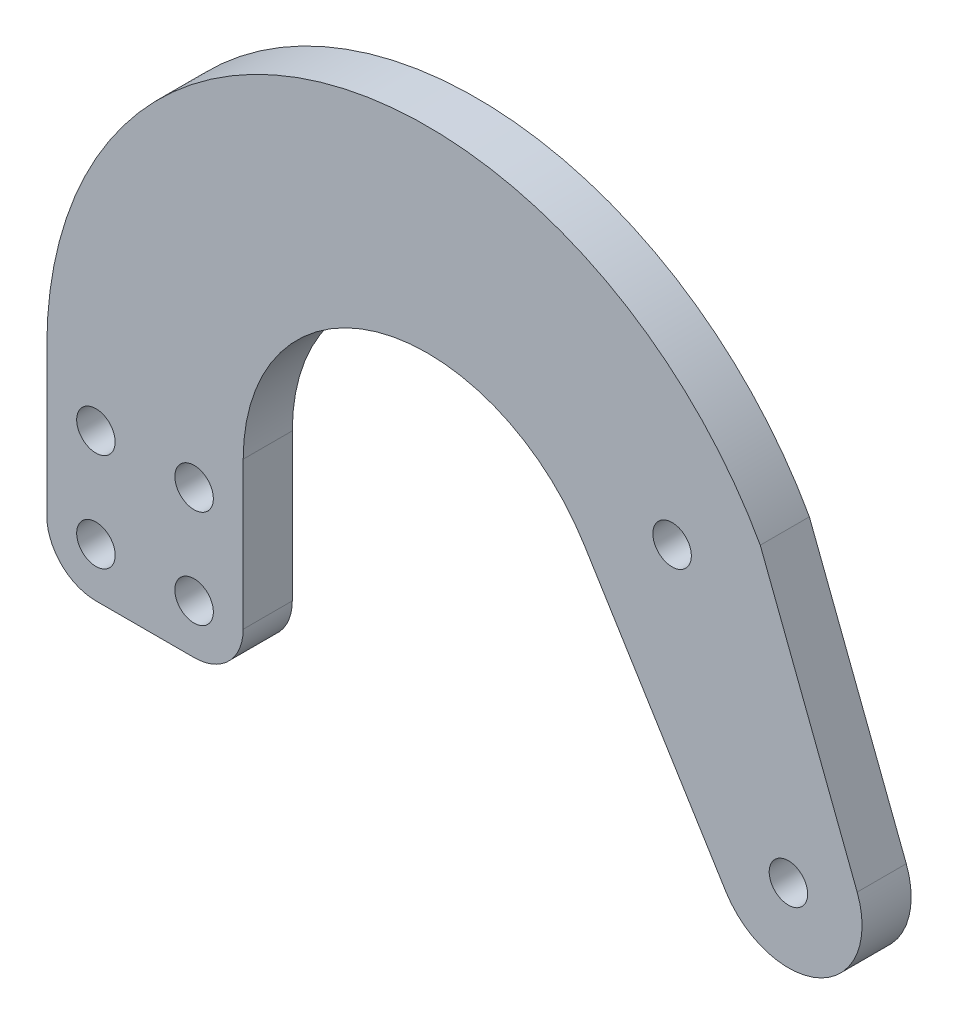
ISO-10303-21;
HEADER;
FILE_DESCRIPTION(('STEP AP214'),'2;1');
FILE_NAME('part.step','',(''),(''),'','','');
FILE_SCHEMA(('AUTOMOTIVE_DESIGN { 1 0 10303 214 1 1 1 1 }'));
ENDSEC;
DATA;
#1=APPLICATION_CONTEXT('core data for automotive mechanical design processes');
#2=APPLICATION_PROTOCOL_DEFINITION('international standard','automotive_design',2000,#1);
#3=PRODUCT_CONTEXT('',#1,'mechanical');
#4=PRODUCT('Part','Part','',(#3));
#5=PRODUCT_RELATED_PRODUCT_CATEGORY('part','',(#4));
#6=PRODUCT_DEFINITION_FORMATION('','',#4);
#7=PRODUCT_DEFINITION_CONTEXT('part definition',#1,'design');
#8=PRODUCT_DEFINITION('design','',#6,#7);
#9=PRODUCT_DEFINITION_SHAPE('','',#8);
#10=(LENGTH_UNIT() NAMED_UNIT(*) SI_UNIT(.MILLI.,.METRE.));
#11=(NAMED_UNIT(*) PLANE_ANGLE_UNIT() SI_UNIT($,.RADIAN.));
#12=(NAMED_UNIT(*) SI_UNIT($,.STERADIAN.) SOLID_ANGLE_UNIT());
#13=UNCERTAINTY_MEASURE_WITH_UNIT(LENGTH_MEASURE(1.E-05),#10,'distance_accuracy_value','');
#14=(GEOMETRIC_REPRESENTATION_CONTEXT(3) GLOBAL_UNCERTAINTY_ASSIGNED_CONTEXT((#13)) GLOBAL_UNIT_ASSIGNED_CONTEXT((#10,
#11,#12)) REPRESENTATION_CONTEXT('',''));
#15=CARTESIAN_POINT('',(0.,0.,0.));
#16=DIRECTION('',(0.,0.,1.));
#17=DIRECTION('',(1.,0.,0.));
#18=AXIS2_PLACEMENT_3D('',#15,#16,#17);
#19=CARTESIAN_POINT('',(419.576393347955,161.363289638392,6.35));
#20=DIRECTION('',(-0.933354733382761,-0.358955347741184,0.));
#21=DIRECTION('',(0.358955347741184,-0.933354733382761,0.));
#22=AXIS2_PLACEMENT_3D('',#19,#20,#21);
#23=PLANE('',#22);
#24=DIRECTION('',(0.358955347741184,-0.933354733382761,0.));
#25=VECTOR('',#24,1.);
#26=CARTESIAN_POINT('',(419.576393347955,161.363289638392,0.));
#27=LINE('',#26,#25);
#28=CARTESIAN_POINT('',(104.980295392846,979.375220587149,0.));
#29=VERTEX_POINT('',#28);
#30=CARTESIAN_POINT('',(117.516810912706,946.777806523756,0.));
#31=VERTEX_POINT('',#30);
#32=EDGE_CURVE('E140',#29,#31,#27,.T.);
#33=ORIENTED_EDGE('',*,*,#32,.F.);
#34=DIRECTION('',(0.,0.,-1.));
#35=VECTOR('',#34,1.);
#36=CARTESIAN_POINT('',(104.980295392846,979.375220587149,6.35));
#37=LINE('',#36,#35);
#38=CARTESIAN_POINT('',(104.980295392846,979.375220587149,6.35));
#39=VERTEX_POINT('',#38);
#40=EDGE_CURVE('E121',#39,#29,#37,.T.);
#41=ORIENTED_EDGE('',*,*,#40,.F.);
#42=DIRECTION('',(0.358955347741184,-0.933354733382761,0.));
#43=VECTOR('',#42,1.);
#44=CARTESIAN_POINT('',(419.576393347955,161.363289638392,6.35));
#45=LINE('',#44,#43);
#46=CARTESIAN_POINT('',(117.516810912706,946.777806523756,6.35));
#47=VERTEX_POINT('',#46);
#48=EDGE_CURVE('E128',#39,#47,#45,.T.);
#49=ORIENTED_EDGE('',*,*,#48,.T.);
#50=DIRECTION('',(0.,0.,-1.));
#51=VECTOR('',#50,1.);
#52=CARTESIAN_POINT('',(117.516810912706,946.777806523756,6.35));
#53=LINE('',#52,#51);
#54=EDGE_CURVE('E151',#47,#31,#53,.T.);
#55=ORIENTED_EDGE('',*,*,#54,.T.);
#56=EDGE_LOOP('',(#33,#41,#49,#55));
#57=FACE_BOUND('',#56,.T.);
#58=ADVANCED_FACE('F41',(#57),#23,.F.);
#59=CARTESIAN_POINT('',(108.626607077235,943.358756836521,6.35));
#60=DIRECTION('',(0.,0.,-1.));
#61=DIRECTION('',(1.,0.,0.));
#62=AXIS2_PLACEMENT_3D('',#59,#60,#61);
#63=CYLINDRICAL_SURFACE('',#62,9.52500000000029);
#64=CARTESIAN_POINT('',(108.626607077235,943.358756836521,0.));
#65=DIRECTION('',(0.,0.,1.));
#66=DIRECTION('',(1.,0.,0.));
#67=AXIS2_PLACEMENT_3D('',#64,#65,#66);
#68=CIRCLE('',#67,9.52500000000029);
#69=CARTESIAN_POINT('',(100.521849556355,938.354905267206,0.));
#70=VERTEX_POINT('',#69);
#71=EDGE_CURVE('E214',#70,#31,#68,.T.);
#72=ORIENTED_EDGE('',*,*,#71,.T.);
#73=ORIENTED_EDGE('',*,*,#54,.F.);
#74=CARTESIAN_POINT('',(108.626607077235,943.358756836521,6.35));
#75=DIRECTION('',(0.,0.,1.));
#76=DIRECTION('',(1.,0.,0.));
#77=AXIS2_PLACEMENT_3D('',#74,#75,#76);
#78=CIRCLE('',#77,9.52500000000029);
#79=CARTESIAN_POINT('',(100.521849556355,938.354905267206,6.35));
#80=VERTEX_POINT('',#79);
#81=EDGE_CURVE('E133',#80,#47,#78,.T.);
#82=ORIENTED_EDGE('',*,*,#81,.F.);
#83=DIRECTION('',(0.,0.,-1.));
#84=VECTOR('',#83,1.);
#85=CARTESIAN_POINT('',(100.521849556355,938.354905267206,6.35));
#86=LINE('',#85,#84);
#87=EDGE_CURVE('E218',#80,#70,#86,.T.);
#88=ORIENTED_EDGE('',*,*,#87,.T.);
#89=EDGE_LOOP('',(#72,#73,#82,#88));
#90=FACE_BOUND('',#89,.T.);
#91=ADVANCED_FACE('F239',(#90),#63,.T.);
#92=CARTESIAN_POINT('',(492.231106998098,303.901923144798,6.35));
#93=DIRECTION('',(-0.850893178045195,-0.525338747434593,0.));
#94=DIRECTION('',(0.525338747434593,-0.850893178045196,0.));
#95=AXIS2_PLACEMENT_3D('',#92,#93,#94);
#96=PLANE('',#95);
#97=DIRECTION('',(0.525338747434593,-0.850893178045196,0.));
#98=VECTOR('',#97,1.);
#99=CARTESIAN_POINT('',(492.231106998098,303.901923144798,0.));
#100=LINE('',#99,#98);
#101=CARTESIAN_POINT('',(82.1743938022014,968.072349510435,0.));
#102=VERTEX_POINT('',#101);
#103=EDGE_CURVE('E212',#102,#70,#100,.T.);
#104=ORIENTED_EDGE('',*,*,#103,.T.);
#105=ORIENTED_EDGE('',*,*,#87,.F.);
#106=DIRECTION('',(0.525338747434593,-0.850893178045196,0.));
#107=VECTOR('',#106,1.);
#108=CARTESIAN_POINT('',(492.231106998098,303.901923144798,6.35));
#109=LINE('',#108,#107);
#110=CARTESIAN_POINT('',(82.1743938022014,968.072349510435,6.35));
#111=VERTEX_POINT('',#110);
#112=EDGE_CURVE('E144',#111,#80,#109,.T.);
#113=ORIENTED_EDGE('',*,*,#112,.F.);
#114=DIRECTION('',(0.,0.,-1.));
#115=VECTOR('',#114,1.);
#116=CARTESIAN_POINT('',(82.1743938022014,968.072349510435,6.35));
#117=LINE('',#116,#115);
#118=EDGE_CURVE('E221',#111,#102,#117,.T.);
#119=ORIENTED_EDGE('',*,*,#118,.T.);
#120=EDGE_LOOP('',(#104,#105,#113,#119));
#121=FACE_BOUND('',#120,.T.);
#122=ADVANCED_FACE('F236',(#121),#96,.T.);
#123=CARTESIAN_POINT('',(61.9125000000002,955.562720587149,6.35));
#124=DIRECTION('',(0.,0.,-1.));
#125=DIRECTION('',(1.,0.,0.));
#126=AXIS2_PLACEMENT_3D('',#123,#124,#125);
#127=CYLINDRICAL_SURFACE('',#126,23.8125);
#128=CARTESIAN_POINT('',(61.9125000000002,955.562720587149,0.));
#129=DIRECTION('',(0.,0.,1.));
#130=DIRECTION('',(1.,0.,0.));
#131=AXIS2_PLACEMENT_3D('',#128,#129,#130);
#132=CIRCLE('',#131,23.8125);
#133=CARTESIAN_POINT('',(38.1000000000001,955.562720587149,0.));
#134=VERTEX_POINT('',#133);
#135=EDGE_CURVE('E209',#102,#134,#132,.T.);
#136=ORIENTED_EDGE('',*,*,#135,.F.);
#137=ORIENTED_EDGE('',*,*,#118,.F.);
#138=CARTESIAN_POINT('',(61.9125000000002,955.562720587149,6.35));
#139=DIRECTION('',(0.,0.,1.));
#140=DIRECTION('',(1.,0.,0.));
#141=AXIS2_PLACEMENT_3D('',#138,#139,#140);
#142=CIRCLE('',#141,23.8125);
#143=CARTESIAN_POINT('',(38.1000000000001,955.562720587149,6.35));
#144=VERTEX_POINT('',#143);
#145=EDGE_CURVE('E175',#111,#144,#142,.T.);
#146=ORIENTED_EDGE('',*,*,#145,.T.);
#147=DIRECTION('',(0.,0.,-1.));
#148=VECTOR('',#147,1.);
#149=CARTESIAN_POINT('',(38.1000000000001,955.562720587149,6.35));
#150=LINE('',#149,#148);
#151=EDGE_CURVE('E142',#144,#134,#150,.T.);
#152=ORIENTED_EDGE('',*,*,#151,.T.);
#153=EDGE_LOOP('',(#136,#137,#146,#152));
#154=FACE_BOUND('',#153,.T.);
#155=ADVANCED_FACE('F226',(#154),#127,.F.);
#156=CARTESIAN_POINT('',(38.0999999999988,0.,6.35));
#157=DIRECTION('',(1.,0.,0.));
#158=DIRECTION('',(0.,1.,0.));
#159=AXIS2_PLACEMENT_3D('',#156,#157,#158);
#160=PLANE('',#159);
#161=DIRECTION('',(0.,1.,0.));
#162=VECTOR('',#161,1.);
#163=CARTESIAN_POINT('',(38.0999999999988,0.,0.));
#164=LINE('',#163,#162);
#165=CARTESIAN_POINT('',(38.1000000000001,936.512720587149,0.));
#166=VERTEX_POINT('',#165);
#167=EDGE_CURVE('E207',#166,#134,#164,.T.);
#168=ORIENTED_EDGE('',*,*,#167,.T.);
#169=ORIENTED_EDGE('',*,*,#151,.F.);
#170=DIRECTION('',(0.,1.,0.));
#171=VECTOR('',#170,1.);
#172=CARTESIAN_POINT('',(38.0999999999988,0.,6.35));
#173=LINE('',#172,#171);
#174=CARTESIAN_POINT('',(38.1000000000001,936.512720587149,6.35));
#175=VERTEX_POINT('',#174);
#176=EDGE_CURVE('E173',#175,#144,#173,.T.);
#177=ORIENTED_EDGE('',*,*,#176,.F.);
#178=DIRECTION('',(0.,0.,-1.));
#179=VECTOR('',#178,1.);
#180=CARTESIAN_POINT('',(38.1000000000001,936.512720587149,6.35));
#181=LINE('',#180,#179);
#182=EDGE_CURVE('E158',#166,#175,#181,.F.);
#183=ORIENTED_EDGE('',*,*,#182,.F.);
#184=EDGE_LOOP('',(#168,#169,#177,#183));
#185=FACE_BOUND('',#184,.T.);
#186=ADVANCED_FACE('F243',(#185),#160,.T.);
#187=CARTESIAN_POINT('',(0.,930.162720587149,6.35));
#188=DIRECTION('',(0.,-1.,0.));
#189=DIRECTION('',(0.,0.,1.));
#190=AXIS2_PLACEMENT_3D('',#187,#188,#189);
#191=PLANE('',#190);
#192=DIRECTION('',(1.,0.,0.));
#193=VECTOR('',#192,1.);
#194=CARTESIAN_POINT('',(0.,930.162720587149,6.35));
#195=LINE('',#194,#193);
#196=CARTESIAN_POINT('',(19.0500000000001,930.162720587149,6.35));
#197=VERTEX_POINT('',#196);
#198=CARTESIAN_POINT('',(31.7500000000001,930.162720587149,6.35));
#199=VERTEX_POINT('',#198);
#200=EDGE_CURVE('E170',#197,#199,#195,.T.);
#201=ORIENTED_EDGE('',*,*,#200,.F.);
#202=DIRECTION('',(0.,0.,-1.));
#203=VECTOR('',#202,1.);
#204=CARTESIAN_POINT('',(19.0500000000001,930.162720587149,6.35));
#205=LINE('',#204,#203);
#206=CARTESIAN_POINT('',(19.0500000000001,930.162720587149,0.));
#207=VERTEX_POINT('',#206);
#208=EDGE_CURVE('E148',#207,#197,#205,.F.);
#209=ORIENTED_EDGE('',*,*,#208,.F.);
#210=DIRECTION('',(1.,0.,0.));
#211=VECTOR('',#210,1.);
#212=CARTESIAN_POINT('',(0.,930.162720587149,0.));
#213=LINE('',#212,#211);
#214=CARTESIAN_POINT('',(31.7500000000001,930.162720587149,0.));
#215=VERTEX_POINT('',#214);
#216=EDGE_CURVE('E172',#207,#215,#213,.T.);
#217=ORIENTED_EDGE('',*,*,#216,.T.);
#218=DIRECTION('',(0.,0.,-1.));
#219=VECTOR('',#218,1.);
#220=CARTESIAN_POINT('',(31.7500000000001,930.162720587149,6.35));
#221=LINE('',#220,#219);
#222=EDGE_CURVE('E150',#199,#215,#221,.T.);
#223=ORIENTED_EDGE('',*,*,#222,.F.);
#224=EDGE_LOOP('',(#201,#209,#217,#223));
#225=FACE_BOUND('',#224,.T.);
#226=ADVANCED_FACE('F168',(#225),#191,.T.);
#227=CARTESIAN_POINT('',(12.6999999999995,0.,6.35));
#228=DIRECTION('',(1.,0.,0.));
#229=DIRECTION('',(0.,1.,0.));
#230=AXIS2_PLACEMENT_3D('',#227,#228,#229);
#231=PLANE('',#230);
#232=DIRECTION('',(0.,1.,0.));
#233=VECTOR('',#232,1.);
#234=CARTESIAN_POINT('',(12.6999999999995,0.,6.35));
#235=LINE('',#234,#233);
#236=CARTESIAN_POINT('',(12.7000000000001,936.512720587149,6.35));
#237=VERTEX_POINT('',#236);
#238=CARTESIAN_POINT('',(12.7000000000001,955.562720587149,6.35));
#239=VERTEX_POINT('',#238);
#240=EDGE_CURVE('E127',#237,#239,#235,.T.);
#241=ORIENTED_EDGE('',*,*,#240,.T.);
#242=DIRECTION('',(0.,0.,-1.));
#243=VECTOR('',#242,1.);
#244=CARTESIAN_POINT('',(12.7000000000001,955.562720587149,6.35));
#245=LINE('',#244,#243);
#246=CARTESIAN_POINT('',(12.7000000000001,955.562720587149,0.));
#247=VERTEX_POINT('',#246);
#248=EDGE_CURVE('E124',#239,#247,#245,.T.);
#249=ORIENTED_EDGE('',*,*,#248,.T.);
#250=DIRECTION('',(0.,1.,0.));
#251=VECTOR('',#250,1.);
#252=CARTESIAN_POINT('',(12.6999999999995,0.,0.));
#253=LINE('',#252,#251);
#254=CARTESIAN_POINT('',(12.7000000000001,936.512720587149,0.));
#255=VERTEX_POINT('',#254);
#256=EDGE_CURVE('E203',#255,#247,#253,.T.);
#257=ORIENTED_EDGE('',*,*,#256,.F.);
#258=DIRECTION('',(0.,0.,-1.));
#259=VECTOR('',#258,1.);
#260=CARTESIAN_POINT('',(12.7000000000001,936.512720587149,0.));
#261=LINE('',#260,#259);
#262=EDGE_CURVE('E11',#237,#255,#261,.T.);
#263=ORIENTED_EDGE('',*,*,#262,.F.);
#264=EDGE_LOOP('',(#241,#249,#257,#263));
#265=FACE_BOUND('',#264,.T.);
#266=ADVANCED_FACE('F242',(#265),#231,.F.);
#267=CARTESIAN_POINT('',(108.626607077235,943.358756836521,6.35));
#268=DIRECTION('',(0.,0.,-1.));
#269=DIRECTION('',(1.,0.,0.));
#270=AXIS2_PLACEMENT_3D('',#267,#268,#269);
#271=CYLINDRICAL_SURFACE('',#270,2.48920000000009);
#272=CARTESIAN_POINT('',(108.626607077235,943.358756836521,6.35));
#273=DIRECTION('',(0.,0.,1.));
#274=DIRECTION('',(1.,0.,0.));
#275=AXIS2_PLACEMENT_3D('',#272,#273,#274);
#276=CIRCLE('',#275,2.48920000000009);
#277=CARTESIAN_POINT('',(111.115807077235,943.358756836521,6.35));
#278=VERTEX_POINT('',#277);
#279=EDGE_CURVE('E137',#278,#278,#276,.T.);
#280=ORIENTED_EDGE('',*,*,#279,.T.);
#281=EDGE_LOOP('',(#280));
#282=FACE_BOUND('',#281,.T.);
#283=CARTESIAN_POINT('',(108.626607077235,943.358756836521,0.));
#284=DIRECTION('',(0.,0.,1.));
#285=DIRECTION('',(1.,0.,0.));
#286=AXIS2_PLACEMENT_3D('',#283,#284,#285);
#287=CIRCLE('',#286,2.48920000000009);
#288=CARTESIAN_POINT('',(111.115807077235,943.358756836521,0.));
#289=VERTEX_POINT('',#288);
#290=EDGE_CURVE('E197',#289,#289,#287,.T.);
#291=ORIENTED_EDGE('',*,*,#290,.F.);
#292=EDGE_LOOP('',(#291));
#293=FACE_BOUND('',#292,.T.);
#294=ADVANCED_FACE('F261',(#282,#293),#271,.F.);
#295=CARTESIAN_POINT('',(93.5773445975235,973.723785048792,6.35));
#296=DIRECTION('',(0.,0.,-1.));
#297=DIRECTION('',(1.,0.,0.));
#298=AXIS2_PLACEMENT_3D('',#295,#296,#297);
#299=CYLINDRICAL_SURFACE('',#298,2.48920000000009);
#300=CARTESIAN_POINT('',(93.5773445975235,973.723785048792,6.35));
#301=DIRECTION('',(0.,0.,1.));
#302=DIRECTION('',(1.,0.,0.));
#303=AXIS2_PLACEMENT_3D('',#300,#301,#302);
#304=CIRCLE('',#303,2.48920000000009);
#305=CARTESIAN_POINT('',(96.0665445975236,973.723785048792,6.35));
#306=VERTEX_POINT('',#305);
#307=EDGE_CURVE('E471',#306,#306,#304,.T.);
#308=ORIENTED_EDGE('',*,*,#307,.T.);
#309=EDGE_LOOP('',(#308));
#310=FACE_BOUND('',#309,.T.);
#311=CARTESIAN_POINT('',(93.5773445975235,973.723785048792,0.));
#312=DIRECTION('',(0.,0.,1.));
#313=DIRECTION('',(1.,0.,0.));
#314=AXIS2_PLACEMENT_3D('',#311,#312,#313);
#315=CIRCLE('',#314,2.48920000000009);
#316=CARTESIAN_POINT('',(96.0665445975236,973.723785048792,0.));
#317=VERTEX_POINT('',#316);
#318=EDGE_CURVE('E194',#317,#317,#315,.T.);
#319=ORIENTED_EDGE('',*,*,#318,.F.);
#320=EDGE_LOOP('',(#319));
#321=FACE_BOUND('',#320,.T.);
#322=ADVANCED_FACE('F264',(#310,#321),#299,.F.);
#323=CARTESIAN_POINT('',(19.0500000000001,949.212720587149,6.35));
#324=DIRECTION('',(0.,0.,-1.));
#325=DIRECTION('',(1.,0.,0.));
#326=AXIS2_PLACEMENT_3D('',#323,#324,#325);
#327=CYLINDRICAL_SURFACE('',#326,2.48919999999989);
#328=CARTESIAN_POINT('',(19.0500000000001,949.212720587149,6.35));
#329=DIRECTION('',(0.,0.,1.));
#330=DIRECTION('',(1.,0.,0.));
#331=AXIS2_PLACEMENT_3D('',#328,#329,#330);
#332=CIRCLE('',#331,2.48919999999989);
#333=CARTESIAN_POINT('',(21.5392,949.212720587149,6.35));
#334=VERTEX_POINT('',#333);
#335=EDGE_CURVE('E467',#334,#334,#332,.T.);
#336=ORIENTED_EDGE('',*,*,#335,.T.);
#337=EDGE_LOOP('',(#336));
#338=FACE_BOUND('',#337,.T.);
#339=CARTESIAN_POINT('',(19.0500000000001,949.212720587149,0.));
#340=DIRECTION('',(0.,0.,1.));
#341=DIRECTION('',(1.,0.,0.));
#342=AXIS2_PLACEMENT_3D('',#339,#340,#341);
#343=CIRCLE('',#342,2.48919999999989);
#344=CARTESIAN_POINT('',(21.5392,949.212720587149,0.));
#345=VERTEX_POINT('',#344);
#346=EDGE_CURVE('E191',#345,#345,#343,.T.);
#347=ORIENTED_EDGE('',*,*,#346,.F.);
#348=EDGE_LOOP('',(#347));
#349=FACE_BOUND('',#348,.T.);
#350=ADVANCED_FACE('F268',(#338,#349),#327,.F.);
#351=CARTESIAN_POINT('',(31.7500000000001,949.212720587149,6.35));
#352=DIRECTION('',(0.,0.,-1.));
#353=DIRECTION('',(1.,0.,0.));
#354=AXIS2_PLACEMENT_3D('',#351,#352,#353);
#355=CYLINDRICAL_SURFACE('',#354,2.48919999999991);
#356=CARTESIAN_POINT('',(31.7500000000001,949.212720587149,6.35));
#357=DIRECTION('',(0.,0.,1.));
#358=DIRECTION('',(1.,0.,0.));
#359=AXIS2_PLACEMENT_3D('',#356,#357,#358);
#360=CIRCLE('',#359,2.48919999999991);
#361=CARTESIAN_POINT('',(34.2392,949.212720587149,6.35));
#362=VERTEX_POINT('',#361);
#363=EDGE_CURVE('E463',#362,#362,#360,.T.);
#364=ORIENTED_EDGE('',*,*,#363,.T.);
#365=EDGE_LOOP('',(#364));
#366=FACE_BOUND('',#365,.T.);
#367=CARTESIAN_POINT('',(31.7500000000001,949.212720587149,0.));
#368=DIRECTION('',(0.,0.,1.));
#369=DIRECTION('',(1.,0.,0.));
#370=AXIS2_PLACEMENT_3D('',#367,#368,#369);
#371=CIRCLE('',#370,2.48919999999991);
#372=CARTESIAN_POINT('',(34.2392,949.212720587149,0.));
#373=VERTEX_POINT('',#372);
#374=EDGE_CURVE('E188',#373,#373,#371,.T.);
#375=ORIENTED_EDGE('',*,*,#374,.F.);
#376=EDGE_LOOP('',(#375));
#377=FACE_BOUND('',#376,.T.);
#378=ADVANCED_FACE('F272',(#366,#377),#355,.F.);
#379=CARTESIAN_POINT('',(31.7500000000001,936.512720587149,6.35));
#380=DIRECTION('',(0.,0.,-1.));
#381=DIRECTION('',(1.,0.,0.));
#382=AXIS2_PLACEMENT_3D('',#379,#380,#381);
#383=CYLINDRICAL_SURFACE('',#382,2.48919999999991);
#384=CARTESIAN_POINT('',(31.7500000000001,936.512720587149,6.35));
#385=DIRECTION('',(0.,0.,1.));
#386=DIRECTION('',(1.,0.,0.));
#387=AXIS2_PLACEMENT_3D('',#384,#385,#386);
#388=CIRCLE('',#387,2.48919999999991);
#389=CARTESIAN_POINT('',(34.2392,936.512720587149,6.35));
#390=VERTEX_POINT('',#389);
#391=EDGE_CURVE('E459',#390,#390,#388,.T.);
#392=ORIENTED_EDGE('',*,*,#391,.T.);
#393=EDGE_LOOP('',(#392));
#394=FACE_BOUND('',#393,.T.);
#395=CARTESIAN_POINT('',(31.7500000000001,936.512720587149,0.));
#396=DIRECTION('',(0.,0.,1.));
#397=DIRECTION('',(1.,0.,0.));
#398=AXIS2_PLACEMENT_3D('',#395,#396,#397);
#399=CIRCLE('',#398,2.48919999999991);
#400=CARTESIAN_POINT('',(34.2392,936.512720587149,0.));
#401=VERTEX_POINT('',#400);
#402=EDGE_CURVE('E185',#401,#401,#399,.T.);
#403=ORIENTED_EDGE('',*,*,#402,.F.);
#404=EDGE_LOOP('',(#403));
#405=FACE_BOUND('',#404,.T.);
#406=ADVANCED_FACE('F276',(#394,#405),#383,.F.);
#407=CARTESIAN_POINT('',(19.0500000000001,936.512720587149,6.35));
#408=DIRECTION('',(0.,0.,-1.));
#409=DIRECTION('',(1.,0.,0.));
#410=AXIS2_PLACEMENT_3D('',#407,#408,#409);
#411=CYLINDRICAL_SURFACE('',#410,2.48919999999989);
#412=CARTESIAN_POINT('',(19.0500000000001,936.512720587149,6.35));
#413=DIRECTION('',(0.,0.,1.));
#414=DIRECTION('',(1.,0.,0.));
#415=AXIS2_PLACEMENT_3D('',#412,#413,#414);
#416=CIRCLE('',#415,2.48919999999989);
#417=CARTESIAN_POINT('',(21.5392,936.512720587149,6.35));
#418=VERTEX_POINT('',#417);
#419=EDGE_CURVE('E216',#418,#418,#416,.T.);
#420=ORIENTED_EDGE('',*,*,#419,.T.);
#421=EDGE_LOOP('',(#420));
#422=FACE_BOUND('',#421,.T.);
#423=CARTESIAN_POINT('',(19.0500000000001,936.512720587149,0.));
#424=DIRECTION('',(0.,0.,1.));
#425=DIRECTION('',(1.,0.,0.));
#426=AXIS2_PLACEMENT_3D('',#423,#424,#425);
#427=CIRCLE('',#426,2.48919999999989);
#428=CARTESIAN_POINT('',(21.5392,936.512720587149,0.));
#429=VERTEX_POINT('',#428);
#430=EDGE_CURVE('E182',#429,#429,#427,.T.);
#431=ORIENTED_EDGE('',*,*,#430,.F.);
#432=EDGE_LOOP('',(#431));
#433=FACE_BOUND('',#432,.T.);
#434=ADVANCED_FACE('F280',(#422,#433),#411,.F.);
#435=CARTESIAN_POINT('',(61.9125000000002,955.562720587149,6.35));
#436=DIRECTION('',(0.,0.,-1.));
#437=DIRECTION('',(1.,0.,0.));
#438=AXIS2_PLACEMENT_3D('',#435,#436,#437);
#439=CYLINDRICAL_SURFACE('',#438,49.2125);
#440=CARTESIAN_POINT('',(61.9125000000002,955.562720587149,0.));
#441=DIRECTION('',(0.,0.,1.));
#442=DIRECTION('',(1.,0.,0.));
#443=AXIS2_PLACEMENT_3D('',#440,#441,#442);
#444=CIRCLE('',#443,49.2125);
#445=EDGE_CURVE('E201',#29,#247,#444,.T.);
#446=ORIENTED_EDGE('',*,*,#445,.T.);
#447=ORIENTED_EDGE('',*,*,#248,.F.);
#448=CARTESIAN_POINT('',(61.9125000000002,955.562720587149,6.35));
#449=DIRECTION('',(0.,0.,1.));
#450=DIRECTION('',(1.,0.,0.));
#451=AXIS2_PLACEMENT_3D('',#448,#449,#450);
#452=CIRCLE('',#451,49.2125);
#453=EDGE_CURVE('E117',#39,#239,#452,.T.);
#454=ORIENTED_EDGE('',*,*,#453,.F.);
#455=ORIENTED_EDGE('',*,*,#40,.T.);
#456=EDGE_LOOP('',(#446,#447,#454,#455));
#457=FACE_BOUND('',#456,.T.);
#458=ADVANCED_FACE('F119',(#457),#439,.T.);
#459=CARTESIAN_POINT('',(0.,0.,6.35));
#460=DIRECTION('',(0.,0.,-1.));
#461=DIRECTION('',(1.,0.,0.));
#462=AXIS2_PLACEMENT_3D('',#459,#460,#461);
#463=PLANE('',#462);
#464=ORIENTED_EDGE('',*,*,#419,.F.);
#465=EDGE_LOOP('',(#464));
#466=FACE_BOUND('',#465,.T.);
#467=ORIENTED_EDGE('',*,*,#391,.F.);
#468=EDGE_LOOP('',(#467));
#469=FACE_BOUND('',#468,.T.);
#470=ORIENTED_EDGE('',*,*,#363,.F.);
#471=EDGE_LOOP('',(#470));
#472=FACE_BOUND('',#471,.T.);
#473=ORIENTED_EDGE('',*,*,#335,.F.);
#474=EDGE_LOOP('',(#473));
#475=FACE_BOUND('',#474,.T.);
#476=ORIENTED_EDGE('',*,*,#307,.F.);
#477=EDGE_LOOP('',(#476));
#478=FACE_BOUND('',#477,.T.);
#479=ORIENTED_EDGE('',*,*,#279,.F.);
#480=EDGE_LOOP('',(#479));
#481=FACE_BOUND('',#480,.T.);
#482=ORIENTED_EDGE('',*,*,#176,.T.);
#483=ORIENTED_EDGE('',*,*,#145,.F.);
#484=ORIENTED_EDGE('',*,*,#112,.T.);
#485=ORIENTED_EDGE('',*,*,#81,.T.);
#486=ORIENTED_EDGE('',*,*,#48,.F.);
#487=ORIENTED_EDGE('',*,*,#453,.T.);
#488=ORIENTED_EDGE('',*,*,#240,.F.);
#489=CARTESIAN_POINT('',(19.0500000000001,936.512720587149,6.35));
#490=DIRECTION('',(0.,0.,1.));
#491=DIRECTION('',(1.,0.,0.));
#492=AXIS2_PLACEMENT_3D('',#489,#490,#491);
#493=CIRCLE('',#492,6.35);
#494=EDGE_CURVE('E55',#197,#237,#493,.F.);
#495=ORIENTED_EDGE('',*,*,#494,.F.);
#496=ORIENTED_EDGE('',*,*,#200,.T.);
#497=CARTESIAN_POINT('',(31.7500000000001,936.512720587149,6.35));
#498=DIRECTION('',(0.,0.,1.));
#499=DIRECTION('',(1.,0.,0.));
#500=AXIS2_PLACEMENT_3D('',#497,#498,#499);
#501=CIRCLE('',#500,6.35);
#502=EDGE_CURVE('E49',#175,#199,#501,.F.);
#503=ORIENTED_EDGE('',*,*,#502,.F.);
#504=EDGE_LOOP('',(#482,#483,#484,#485,#486,#487,#488,#495,#496,#503));
#505=FACE_BOUND('',#504,.T.);
#506=ADVANCED_FACE('F131',(#466,#469,#472,#475,#478,#481,#505),#463,.F.);
#507=CARTESIAN_POINT('',(0.,0.,0.));
#508=DIRECTION('',(0.,0.,-1.));
#509=DIRECTION('',(1.,0.,0.));
#510=AXIS2_PLACEMENT_3D('',#507,#508,#509);
#511=PLANE('',#510);
#512=ORIENTED_EDGE('',*,*,#430,.T.);
#513=EDGE_LOOP('',(#512));
#514=FACE_BOUND('',#513,.T.);
#515=ORIENTED_EDGE('',*,*,#402,.T.);
#516=EDGE_LOOP('',(#515));
#517=FACE_BOUND('',#516,.T.);
#518=ORIENTED_EDGE('',*,*,#374,.T.);
#519=EDGE_LOOP('',(#518));
#520=FACE_BOUND('',#519,.T.);
#521=ORIENTED_EDGE('',*,*,#346,.T.);
#522=EDGE_LOOP('',(#521));
#523=FACE_BOUND('',#522,.T.);
#524=ORIENTED_EDGE('',*,*,#318,.T.);
#525=EDGE_LOOP('',(#524));
#526=FACE_BOUND('',#525,.T.);
#527=ORIENTED_EDGE('',*,*,#290,.T.);
#528=EDGE_LOOP('',(#527));
#529=FACE_BOUND('',#528,.T.);
#530=ORIENTED_EDGE('',*,*,#216,.F.);
#531=CARTESIAN_POINT('',(19.0500000000001,936.512720587149,0.));
#532=DIRECTION('',(0.,0.,1.));
#533=DIRECTION('',(1.,0.,0.));
#534=AXIS2_PLACEMENT_3D('',#531,#532,#533);
#535=CIRCLE('',#534,6.35);
#536=EDGE_CURVE('E154',#255,#207,#535,.T.);
#537=ORIENTED_EDGE('',*,*,#536,.F.);
#538=ORIENTED_EDGE('',*,*,#256,.T.);
#539=ORIENTED_EDGE('',*,*,#445,.F.);
#540=ORIENTED_EDGE('',*,*,#32,.T.);
#541=ORIENTED_EDGE('',*,*,#71,.F.);
#542=ORIENTED_EDGE('',*,*,#103,.F.);
#543=ORIENTED_EDGE('',*,*,#135,.T.);
#544=ORIENTED_EDGE('',*,*,#167,.F.);
#545=CARTESIAN_POINT('',(31.7500000000001,936.512720587149,0.));
#546=DIRECTION('',(0.,0.,1.));
#547=DIRECTION('',(1.,0.,0.));
#548=AXIS2_PLACEMENT_3D('',#545,#546,#547);
#549=CIRCLE('',#548,6.35);
#550=EDGE_CURVE('E156',#215,#166,#549,.T.);
#551=ORIENTED_EDGE('',*,*,#550,.F.);
#552=EDGE_LOOP('',(#530,#537,#538,#539,#540,#541,#542,#543,#544,#551));
#553=FACE_BOUND('',#552,.T.);
#554=ADVANCED_FACE('F232',(#514,#517,#520,#523,#526,#529,#553),#511,.T.);
#555=CARTESIAN_POINT('',(31.7500000000001,936.512720587149,6.35));
#556=DIRECTION('',(0.,0.,-1.));
#557=DIRECTION('',(1.,0.,0.));
#558=AXIS2_PLACEMENT_3D('',#555,#556,#557);
#559=CYLINDRICAL_SURFACE('',#558,6.35);
#560=ORIENTED_EDGE('',*,*,#502,.T.);
#561=ORIENTED_EDGE('',*,*,#222,.T.);
#562=ORIENTED_EDGE('',*,*,#550,.T.);
#563=ORIENTED_EDGE('',*,*,#182,.T.);
#564=EDGE_LOOP('',(#560,#561,#562,#563));
#565=FACE_BOUND('',#564,.T.);
#566=ADVANCED_FACE('F162',(#565),#559,.T.);
#567=CARTESIAN_POINT('',(19.0500000000001,936.512720587149,6.35));
#568=DIRECTION('',(0.,0.,1.));
#569=DIRECTION('',(-1.,0.,0.));
#570=AXIS2_PLACEMENT_3D('',#567,#568,#569);
#571=CYLINDRICAL_SURFACE('',#570,6.35);
#572=ORIENTED_EDGE('',*,*,#494,.T.);
#573=ORIENTED_EDGE('',*,*,#262,.T.);
#574=ORIENTED_EDGE('',*,*,#536,.T.);
#575=ORIENTED_EDGE('',*,*,#208,.T.);
#576=EDGE_LOOP('',(#572,#573,#574,#575));
#577=FACE_BOUND('',#576,.T.);
#578=ADVANCED_FACE('F43',(#577),#571,.T.);
#579=CLOSED_SHELL('',(#58,#91,#122,#155,#186,#226,#266,#294,#322,#350,#378,#406,#434,#458,#506,
#554,#566,#578));
#580=MANIFOLD_SOLID_BREP('B2',#579);
#581=ADVANCED_BREP_SHAPE_REPRESENTATION('',(#18,#580),#14);
#582=SHAPE_DEFINITION_REPRESENTATION(#9,#581);
ENDSEC;
END-ISO-10303-21;
